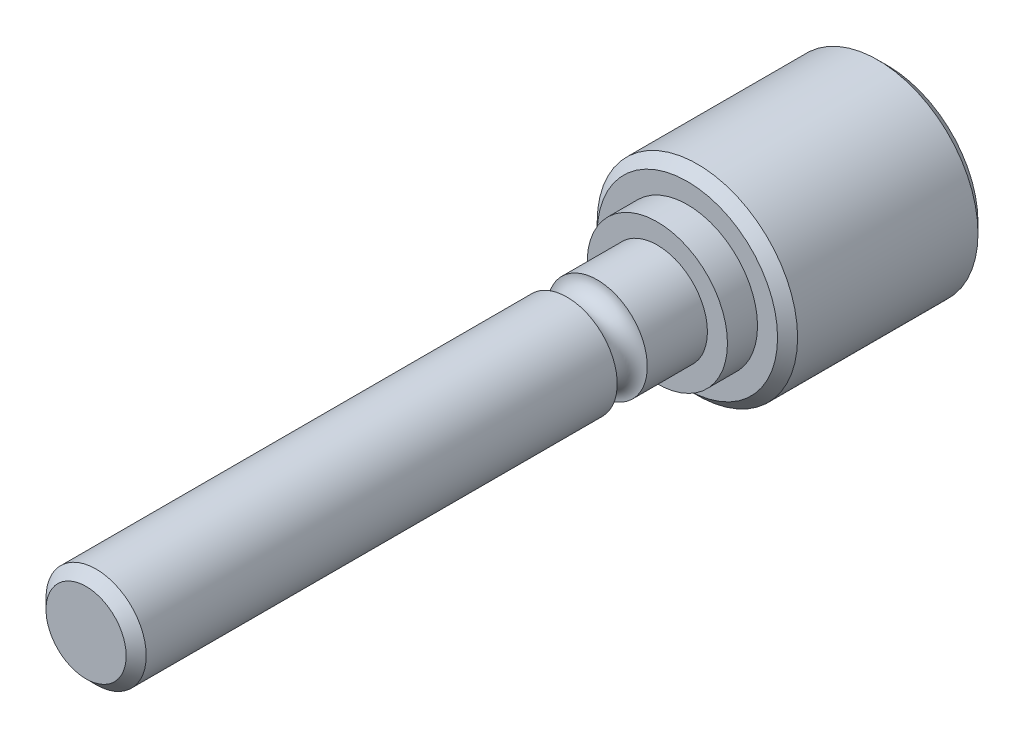
ISO-10303-21;
HEADER;
FILE_DESCRIPTION(('STEP AP214'),'2;1');
FILE_NAME('part.step','',(''),(''),'','','');
FILE_SCHEMA(('AUTOMOTIVE_DESIGN { 1 0 10303 214 1 1 1 1 }'));
ENDSEC;
DATA;
#1=APPLICATION_CONTEXT('core data for automotive mechanical design processes');
#2=APPLICATION_PROTOCOL_DEFINITION('international standard','automotive_design',2000,#1);
#3=PRODUCT_CONTEXT('',#1,'mechanical');
#4=PRODUCT('Part','Part','',(#3));
#5=PRODUCT_RELATED_PRODUCT_CATEGORY('part','',(#4));
#6=PRODUCT_DEFINITION_FORMATION('','',#4);
#7=PRODUCT_DEFINITION_CONTEXT('part definition',#1,'design');
#8=PRODUCT_DEFINITION('design','',#6,#7);
#9=PRODUCT_DEFINITION_SHAPE('','',#8);
#10=(LENGTH_UNIT() NAMED_UNIT(*) SI_UNIT(.MILLI.,.METRE.));
#11=(NAMED_UNIT(*) PLANE_ANGLE_UNIT() SI_UNIT($,.RADIAN.));
#12=(NAMED_UNIT(*) SI_UNIT($,.STERADIAN.) SOLID_ANGLE_UNIT());
#13=UNCERTAINTY_MEASURE_WITH_UNIT(LENGTH_MEASURE(1.E-05),#10,'distance_accuracy_value','');
#14=(GEOMETRIC_REPRESENTATION_CONTEXT(3) GLOBAL_UNCERTAINTY_ASSIGNED_CONTEXT((#13)) GLOBAL_UNIT_ASSIGNED_CONTEXT((#10,
#11,#12)) REPRESENTATION_CONTEXT('',''));
#15=CARTESIAN_POINT('',(0.,0.,0.));
#16=DIRECTION('',(0.,0.,1.));
#17=DIRECTION('',(1.,0.,0.));
#18=AXIS2_PLACEMENT_3D('',#15,#16,#17);
#19=CARTESIAN_POINT('',(0.,0.,80.));
#20=DIRECTION('',(0.,0.,-1.));
#21=DIRECTION('',(-1.,0.,0.));
#22=AXIS2_PLACEMENT_3D('',#19,#20,#21);
#23=CYLINDRICAL_SURFACE('',#22,5.);
#24=CARTESIAN_POINT('',(0.,0.,23.));
#25=DIRECTION('',(0.,0.,1.));
#26=DIRECTION('',(1.,0.,0.));
#27=AXIS2_PLACEMENT_3D('',#24,#25,#26);
#28=CIRCLE('',#27,5.);
#29=CARTESIAN_POINT('',(5.,0.,23.));
#30=VERTEX_POINT('',#29);
#31=EDGE_CURVE('E93',#30,#30,#28,.T.);
#32=ORIENTED_EDGE('',*,*,#31,.T.);
#33=EDGE_LOOP('',(#32));
#34=FACE_BOUND('',#33,.T.);
#35=CARTESIAN_POINT('',(0.,0.,29.));
#36=DIRECTION('',(0.,0.,1.));
#37=DIRECTION('',(1.,0.,0.));
#38=AXIS2_PLACEMENT_3D('',#35,#36,#37);
#39=CIRCLE('',#38,5.);
#40=CARTESIAN_POINT('',(-5.,0.,29.));
#41=VERTEX_POINT('',#40);
#42=EDGE_CURVE('E73',#41,#41,#39,.T.);
#43=ORIENTED_EDGE('',*,*,#42,.F.);
#44=EDGE_LOOP('',(#43));
#45=FACE_BOUND('',#44,.T.);
#46=ADVANCED_FACE('F63',(#34,#45),#23,.T.);
#47=CARTESIAN_POINT('',(0.,0.,20.));
#48=DIRECTION('',(0.,0.,-1.));
#49=DIRECTION('',(-1.,0.,0.));
#50=AXIS2_PLACEMENT_3D('',#47,#48,#49);
#51=CYLINDRICAL_SURFACE('',#50,10.);
#52=CARTESIAN_POINT('',(0.,0.,19.));
#53=DIRECTION('',(0.,0.,1.));
#54=DIRECTION('',(1.,0.,0.));
#55=AXIS2_PLACEMENT_3D('',#52,#53,#54);
#56=CIRCLE('',#55,10.);
#57=CARTESIAN_POINT('',(10.,0.,19.));
#58=VERTEX_POINT('',#57);
#59=EDGE_CURVE('E112',#58,#58,#56,.F.);
#60=ORIENTED_EDGE('',*,*,#59,.T.);
#61=EDGE_LOOP('',(#60));
#62=FACE_BOUND('',#61,.T.);
#63=CARTESIAN_POINT('',(0.,0.,1.00000000000001));
#64=DIRECTION('',(0.,0.,1.));
#65=DIRECTION('',(1.,0.,0.));
#66=AXIS2_PLACEMENT_3D('',#63,#64,#65);
#67=CIRCLE('',#66,10.);
#68=CARTESIAN_POINT('',(10.,0.,1.00000000000001));
#69=VERTEX_POINT('',#68);
#70=EDGE_CURVE('E96',#69,#69,#67,.T.);
#71=ORIENTED_EDGE('',*,*,#70,.T.);
#72=EDGE_LOOP('',(#71));
#73=FACE_BOUND('',#72,.T.);
#74=ADVANCED_FACE('F165',(#62,#73),#51,.T.);
#75=CARTESIAN_POINT('',(0.,0.,20.));
#76=DIRECTION('',(0.,0.,1.));
#77=DIRECTION('',(1.,0.,0.));
#78=AXIS2_PLACEMENT_3D('',#75,#76,#77);
#79=PLANE('',#78);
#80=CARTESIAN_POINT('',(0.,0.,20.));
#81=DIRECTION('',(0.,0.,1.));
#82=DIRECTION('',(1.,0.,0.));
#83=AXIS2_PLACEMENT_3D('',#80,#81,#82);
#84=CIRCLE('',#83,9.00000000000001);
#85=CARTESIAN_POINT('',(9.00000000000002,0.,20.));
#86=VERTEX_POINT('',#85);
#87=EDGE_CURVE('E108',#86,#86,#84,.T.);
#88=ORIENTED_EDGE('',*,*,#87,.T.);
#89=EDGE_LOOP('',(#88));
#90=FACE_BOUND('',#89,.T.);
#91=CARTESIAN_POINT('',(0.,0.,20.));
#92=DIRECTION('',(0.,0.,1.));
#93=DIRECTION('',(1.,0.,0.));
#94=AXIS2_PLACEMENT_3D('',#91,#92,#93);
#95=CIRCLE('',#94,7.);
#96=CARTESIAN_POINT('',(7.00000000000001,0.,20.));
#97=VERTEX_POINT('',#96);
#98=EDGE_CURVE('E90',#97,#97,#95,.T.);
#99=ORIENTED_EDGE('',*,*,#98,.F.);
#100=EDGE_LOOP('',(#99));
#101=FACE_BOUND('',#100,.T.);
#102=ADVANCED_FACE('F170',(#90,#101),#79,.T.);
#103=CARTESIAN_POINT('',(0.,0.,0.));
#104=DIRECTION('',(0.,0.,1.));
#105=DIRECTION('',(1.,0.,0.));
#106=AXIS2_PLACEMENT_3D('',#103,#104,#105);
#107=PLANE('',#106);
#108=CARTESIAN_POINT('',(0.,0.,0.));
#109=DIRECTION('',(0.,0.,1.));
#110=DIRECTION('',(1.,0.,0.));
#111=AXIS2_PLACEMENT_3D('',#108,#109,#110);
#112=CIRCLE('',#111,8.99999999999997);
#113=CARTESIAN_POINT('',(8.99999999999998,0.,0.));
#114=VERTEX_POINT('',#113);
#115=EDGE_CURVE('E104',#114,#114,#112,.F.);
#116=ORIENTED_EDGE('',*,*,#115,.T.);
#117=EDGE_LOOP('',(#116));
#118=FACE_BOUND('',#117,.T.);
#119=ADVANCED_FACE('F237',(#118),#107,.F.);
#120=CARTESIAN_POINT('',(0.,0.,23.));
#121=DIRECTION('',(0.,0.,-1.));
#122=DIRECTION('',(-1.,0.,0.));
#123=AXIS2_PLACEMENT_3D('',#120,#121,#122);
#124=CYLINDRICAL_SURFACE('',#123,7.);
#125=CARTESIAN_POINT('',(0.,0.,23.));
#126=DIRECTION('',(0.,0.,1.));
#127=DIRECTION('',(1.,0.,0.));
#128=AXIS2_PLACEMENT_3D('',#125,#126,#127);
#129=CIRCLE('',#128,7.);
#130=CARTESIAN_POINT('',(7.00000000000001,0.,23.));
#131=VERTEX_POINT('',#130);
#132=EDGE_CURVE('E84',#131,#131,#129,.T.);
#133=ORIENTED_EDGE('',*,*,#132,.F.);
#134=EDGE_LOOP('',(#133));
#135=FACE_BOUND('',#134,.T.);
#136=ORIENTED_EDGE('',*,*,#98,.T.);
#137=EDGE_LOOP('',(#136));
#138=FACE_BOUND('',#137,.T.);
#139=ADVANCED_FACE('F227',(#135,#138),#124,.T.);
#140=CARTESIAN_POINT('',(0.,0.,23.));
#141=DIRECTION('',(0.,0.,1.));
#142=DIRECTION('',(1.,0.,0.));
#143=AXIS2_PLACEMENT_3D('',#140,#141,#142);
#144=PLANE('',#143);
#145=ORIENTED_EDGE('',*,*,#31,.F.);
#146=EDGE_LOOP('',(#145));
#147=FACE_BOUND('',#146,.T.);
#148=ORIENTED_EDGE('',*,*,#132,.T.);
#149=EDGE_LOOP('',(#148));
#150=FACE_BOUND('',#149,.T.);
#151=ADVANCED_FACE('F217',(#147,#150),#144,.T.);
#152=CARTESIAN_POINT('',(0.,0.,1.00000000000001));
#153=DIRECTION('',(0.,0.,1.));
#154=DIRECTION('',(1.,0.,0.));
#155=AXIS2_PLACEMENT_3D('',#152,#153,#154);
#156=CONICAL_SURFACE('',#155,10.,0.785398163397453);
#157=ORIENTED_EDGE('',*,*,#115,.F.);
#158=EDGE_LOOP('',(#157));
#159=FACE_BOUND('',#158,.T.);
#160=ORIENTED_EDGE('',*,*,#70,.F.);
#161=EDGE_LOOP('',(#160));
#162=FACE_BOUND('',#161,.T.);
#163=ADVANCED_FACE('F208',(#159,#162),#156,.T.);
#164=CARTESIAN_POINT('',(0.,0.,20.));
#165=DIRECTION('',(0.,0.,-1.));
#166=DIRECTION('',(-1.,0.,0.));
#167=AXIS2_PLACEMENT_3D('',#164,#165,#166);
#168=CONICAL_SURFACE('',#167,9.00000000000001,0.785398163397451);
#169=ORIENTED_EDGE('',*,*,#59,.F.);
#170=EDGE_LOOP('',(#169));
#171=FACE_BOUND('',#170,.T.);
#172=ORIENTED_EDGE('',*,*,#87,.F.);
#173=EDGE_LOOP('',(#172));
#174=FACE_BOUND('',#173,.T.);
#175=ADVANCED_FACE('F161',(#171,#174),#168,.T.);
#176=CARTESIAN_POINT('',(0.,0.,30.5));
#177=DIRECTION('',(0.,0.,1.));
#178=DIRECTION('',(1.,0.,0.));
#179=AXIS2_PLACEMENT_3D('',#176,#177,#178);
#180=TOROIDAL_SURFACE('',#179,5.,1.5);
#181=CARTESIAN_POINT('',(0.,0.,32.));
#182=DIRECTION('',(0.,0.,-1.));
#183=DIRECTION('',(-1.,0.,0.));
#184=AXIS2_PLACEMENT_3D('',#181,#182,#183);
#185=CIRCLE('',#184,5.);
#186=CARTESIAN_POINT('',(-5.,0.,32.));
#187=VERTEX_POINT('',#186);
#188=EDGE_CURVE('E13',#187,#187,#185,.T.);
#189=ORIENTED_EDGE('',*,*,#188,.T.);
#190=CARTESIAN_POINT('',(-5.,0.,30.5));
#191=DIRECTION('',(0.,1.,0.));
#192=DIRECTION('',(0.,0.,1.));
#193=AXIS2_PLACEMENT_3D('',#190,#191,#192);
#194=CIRCLE('',#193,1.5);
#195=EDGE_CURVE('E79',#187,#41,#194,.T.);
#196=ORIENTED_EDGE('',*,*,#195,.T.);
#197=ORIENTED_EDGE('',*,*,#42,.T.);
#198=ORIENTED_EDGE('',*,*,#195,.F.);
#199=EDGE_LOOP('',(#189,#196,#197,#198));
#200=FACE_BOUND('',#199,.T.);
#201=ADVANCED_FACE('F80',(#200),#180,.F.);
#202=CARTESIAN_POINT('',(0.,0.,80.));
#203=DIRECTION('',(0.,0.,1.));
#204=DIRECTION('',(1.,0.,0.));
#205=AXIS2_PLACEMENT_3D('',#202,#203,#204);
#206=PLANE('',#205);
#207=CARTESIAN_POINT('',(0.,0.,80.));
#208=DIRECTION('',(0.,0.,1.));
#209=DIRECTION('',(1.,0.,0.));
#210=AXIS2_PLACEMENT_3D('',#207,#208,#209);
#211=CIRCLE('',#210,4.);
#212=CARTESIAN_POINT('',(4.00000000000001,0.,80.));
#213=VERTEX_POINT('',#212);
#214=EDGE_CURVE('E116',#213,#213,#211,.T.);
#215=ORIENTED_EDGE('',*,*,#214,.T.);
#216=EDGE_LOOP('',(#215));
#217=FACE_BOUND('',#216,.T.);
#218=ADVANCED_FACE('F153',(#217),#206,.T.);
#219=CARTESIAN_POINT('',(0.,0.,80.));
#220=DIRECTION('',(0.,0.,-1.));
#221=DIRECTION('',(-1.,0.,0.));
#222=AXIS2_PLACEMENT_3D('',#219,#220,#221);
#223=CONICAL_SURFACE('',#222,4.,0.785398163397447);
#224=CARTESIAN_POINT('',(0.,0.,79.));
#225=DIRECTION('',(0.,0.,1.));
#226=DIRECTION('',(1.,0.,0.));
#227=AXIS2_PLACEMENT_3D('',#224,#225,#226);
#228=CIRCLE('',#227,5.);
#229=CARTESIAN_POINT('',(5.00000000000001,0.,79.));
#230=VERTEX_POINT('',#229);
#231=EDGE_CURVE('E120',#230,#230,#228,.F.);
#232=ORIENTED_EDGE('',*,*,#231,.F.);
#233=EDGE_LOOP('',(#232));
#234=FACE_BOUND('',#233,.T.);
#235=ORIENTED_EDGE('',*,*,#214,.F.);
#236=EDGE_LOOP('',(#235));
#237=FACE_BOUND('',#236,.T.);
#238=ADVANCED_FACE('F66',(#234,#237),#223,.T.);
#239=ORIENTED_EDGE('',*,*,#231,.T.);
#240=EDGE_LOOP('',(#239));
#241=FACE_BOUND('',#240,.T.);
#242=ORIENTED_EDGE('',*,*,#188,.F.);
#243=EDGE_LOOP('',(#242));
#244=FACE_BOUND('',#243,.T.);
#245=ADVANCED_FACE('F148',(#241,#244),#23,.T.);
#246=CLOSED_SHELL('',(#46,#74,#102,#119,#139,#151,#163,#175,#201,#218,#238,#245));
#247=MANIFOLD_SOLID_BREP('B2',#246);
#248=ADVANCED_BREP_SHAPE_REPRESENTATION('',(#18,#247),#14);
#249=SHAPE_DEFINITION_REPRESENTATION(#9,#248);
ENDSEC;
END-ISO-10303-21;
